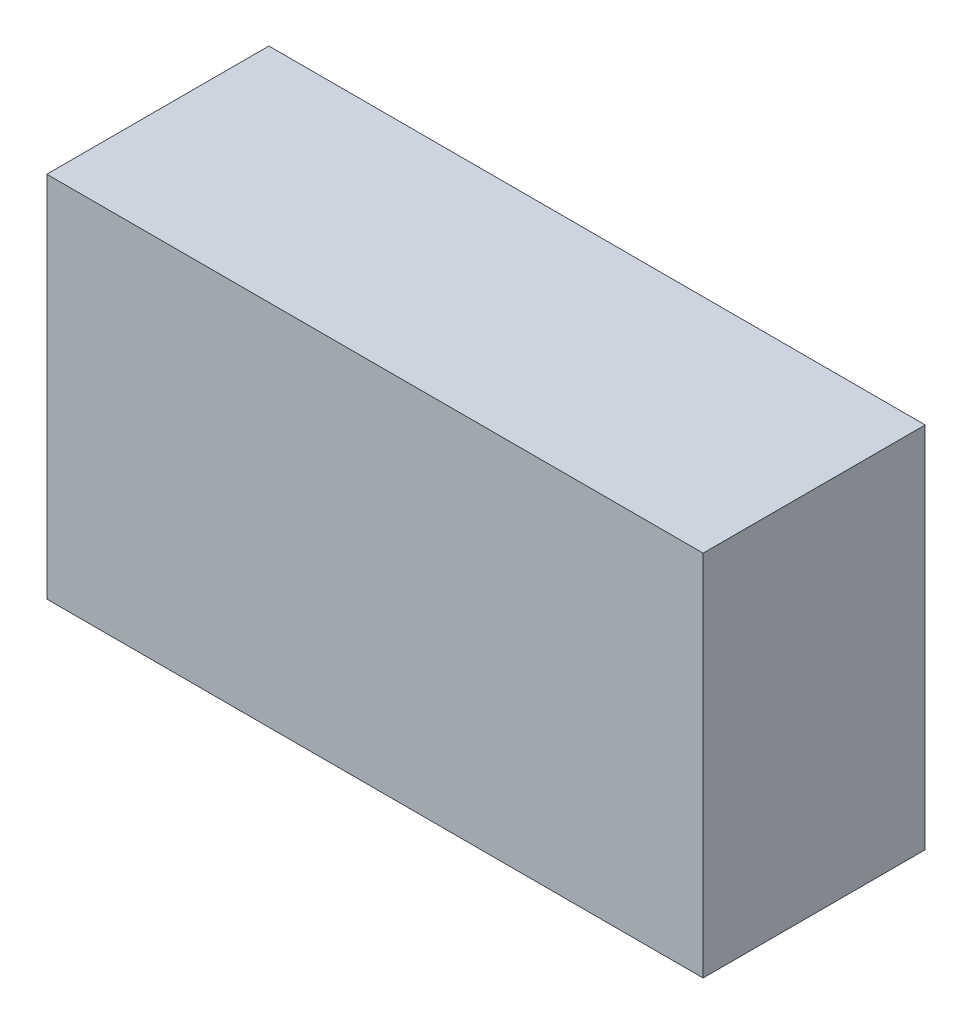
ISO-10303-21;
HEADER;
FILE_DESCRIPTION(('STEP AP214'),'2;1');
FILE_NAME('part.step','',(''),(''),'','','');
FILE_SCHEMA(('AUTOMOTIVE_DESIGN { 1 0 10303 214 1 1 1 1 }'));
ENDSEC;
DATA;
#1=APPLICATION_CONTEXT('core data for automotive mechanical design processes');
#2=APPLICATION_PROTOCOL_DEFINITION('international standard','automotive_design',2000,#1);
#3=PRODUCT_CONTEXT('',#1,'mechanical');
#4=PRODUCT('Part','Part','',(#3));
#5=PRODUCT_RELATED_PRODUCT_CATEGORY('part','',(#4));
#6=PRODUCT_DEFINITION_FORMATION('','',#4);
#7=PRODUCT_DEFINITION_CONTEXT('part definition',#1,'design');
#8=PRODUCT_DEFINITION('design','',#6,#7);
#9=PRODUCT_DEFINITION_SHAPE('','',#8);
#10=(LENGTH_UNIT() NAMED_UNIT(*) SI_UNIT(.MILLI.,.METRE.));
#11=(NAMED_UNIT(*) PLANE_ANGLE_UNIT() SI_UNIT($,.RADIAN.));
#12=(NAMED_UNIT(*) SI_UNIT($,.STERADIAN.) SOLID_ANGLE_UNIT());
#13=UNCERTAINTY_MEASURE_WITH_UNIT(LENGTH_MEASURE(1.E-05),#10,'distance_accuracy_value','');
#14=(GEOMETRIC_REPRESENTATION_CONTEXT(3) GLOBAL_UNCERTAINTY_ASSIGNED_CONTEXT((#13)) GLOBAL_UNIT_ASSIGNED_CONTEXT((#10,
#11,#12)) REPRESENTATION_CONTEXT('',''));
#15=CARTESIAN_POINT('',(0.,0.,0.));
#16=DIRECTION('',(0.,0.,1.));
#17=DIRECTION('',(1.,0.,0.));
#18=AXIS2_PLACEMENT_3D('',#15,#16,#17);
#19=CARTESIAN_POINT('',(9.99999999999967,0.,0.));
#20=DIRECTION('',(1.,0.,0.));
#21=DIRECTION('',(0.,0.,-1.));
#22=AXIS2_PLACEMENT_3D('',#19,#20,#21);
#23=PLANE('',#22);
#24=DIRECTION('',(0.,0.,1.));
#25=VECTOR('',#24,1.);
#26=CARTESIAN_POINT('',(9.99999999999967,360.,0.));
#27=LINE('',#26,#25);
#28=CARTESIAN_POINT('',(9.99999999999967,360.,-213.333333333333));
#29=VERTEX_POINT('',#28);
#30=CARTESIAN_POINT('',(9.99999999999968,360.,-10.));
#31=VERTEX_POINT('',#30);
#32=EDGE_CURVE('E173',#29,#31,#27,.T.);
#33=ORIENTED_EDGE('',*,*,#32,.T.);
#34=DIRECTION('',(0.,-1.,0.));
#35=VECTOR('',#34,1.);
#36=CARTESIAN_POINT('',(9.99999999999968,370.,-10.));
#37=LINE('',#36,#35);
#38=CARTESIAN_POINT('',(9.99999999999967,10.,-10.));
#39=VERTEX_POINT('',#38);
#40=EDGE_CURVE('E71',#31,#39,#37,.T.);
#41=ORIENTED_EDGE('',*,*,#40,.T.);
#42=DIRECTION('',(0.,0.,1.));
#43=VECTOR('',#42,1.);
#44=CARTESIAN_POINT('',(9.99999999999967,10.,0.));
#45=LINE('',#44,#43);
#46=CARTESIAN_POINT('',(9.99999999999967,10.,-213.333333333333));
#47=VERTEX_POINT('',#46);
#48=EDGE_CURVE('E11',#47,#39,#45,.T.);
#49=ORIENTED_EDGE('',*,*,#48,.F.);
#50=DIRECTION('',(0.,1.,0.));
#51=VECTOR('',#50,1.);
#52=CARTESIAN_POINT('',(9.99999999999967,370.,-213.333333333333));
#53=LINE('',#52,#51);
#54=EDGE_CURVE('E166',#47,#29,#53,.T.);
#55=ORIENTED_EDGE('',*,*,#54,.T.);
#56=EDGE_LOOP('',(#33,#41,#49,#55));
#57=FACE_BOUND('',#56,.T.);
#58=DIRECTION('',(0.,1.,0.));
#59=VECTOR('',#58,1.);
#60=CARTESIAN_POINT('',(10.,0.,0.));
#61=LINE('',#60,#59);
#62=CARTESIAN_POINT('',(10.,0.,0.));
#63=VERTEX_POINT('',#62);
#64=CARTESIAN_POINT('',(10.,370.,0.));
#65=VERTEX_POINT('',#64);
#66=EDGE_CURVE('E110',#63,#65,#61,.T.);
#67=ORIENTED_EDGE('',*,*,#66,.T.);
#68=DIRECTION('',(0.,0.,-1.));
#69=VECTOR('',#68,1.);
#70=CARTESIAN_POINT('',(10.,370.,0.));
#71=LINE('',#70,#69);
#72=CARTESIAN_POINT('',(10.,370.,-223.333333333333));
#73=VERTEX_POINT('',#72);
#74=EDGE_CURVE('E112',#65,#73,#71,.T.);
#75=ORIENTED_EDGE('',*,*,#74,.T.);
#76=DIRECTION('',(0.,-1.,0.));
#77=VECTOR('',#76,1.);
#78=CARTESIAN_POINT('',(10.,0.,-223.333333333333));
#79=LINE('',#78,#77);
#80=CARTESIAN_POINT('',(10.,0.,-223.333333333333));
#81=VERTEX_POINT('',#80);
#82=EDGE_CURVE('E63',#73,#81,#79,.T.);
#83=ORIENTED_EDGE('',*,*,#82,.T.);
#84=DIRECTION('',(0.,0.,1.));
#85=VECTOR('',#84,1.);
#86=CARTESIAN_POINT('',(10.,0.,0.));
#87=LINE('',#86,#85);
#88=EDGE_CURVE('E113',#81,#63,#87,.T.);
#89=ORIENTED_EDGE('',*,*,#88,.T.);
#90=EDGE_LOOP('',(#67,#75,#83,#89));
#91=FACE_BOUND('',#90,.T.);
#92=ADVANCED_FACE('F47',(#57,#91),#23,.F.);
#93=CARTESIAN_POINT('',(660.,370.,-223.333333333333));
#94=DIRECTION('',(-1.,0.,0.));
#95=DIRECTION('',(0.,0.,1.));
#96=AXIS2_PLACEMENT_3D('',#93,#94,#95);
#97=PLANE('',#96);
#98=DIRECTION('',(0.,0.,-1.));
#99=VECTOR('',#98,1.);
#100=CARTESIAN_POINT('',(660.,10.,0.));
#101=LINE('',#100,#99);
#102=CARTESIAN_POINT('',(660.,10.,-9.99999999999998));
#103=VERTEX_POINT('',#102);
#104=CARTESIAN_POINT('',(660.,10.,-213.333333333333));
#105=VERTEX_POINT('',#104);
#106=EDGE_CURVE('E179',#103,#105,#101,.T.);
#107=ORIENTED_EDGE('',*,*,#106,.F.);
#108=DIRECTION('',(0.,-1.,0.));
#109=VECTOR('',#108,1.);
#110=CARTESIAN_POINT('',(660.,370.,-9.99999999999998));
#111=LINE('',#110,#109);
#112=CARTESIAN_POINT('',(660.,360.,-9.99999999999998));
#113=VERTEX_POINT('',#112);
#114=EDGE_CURVE('E150',#113,#103,#111,.T.);
#115=ORIENTED_EDGE('',*,*,#114,.F.);
#116=DIRECTION('',(0.,0.,-1.));
#117=VECTOR('',#116,1.);
#118=CARTESIAN_POINT('',(660.,360.,0.));
#119=LINE('',#118,#117);
#120=CARTESIAN_POINT('',(660.,360.,-213.333333333333));
#121=VERTEX_POINT('',#120);
#122=EDGE_CURVE('E187',#113,#121,#119,.T.);
#123=ORIENTED_EDGE('',*,*,#122,.T.);
#124=DIRECTION('',(0.,-1.,0.));
#125=VECTOR('',#124,1.);
#126=CARTESIAN_POINT('',(660.,370.,-213.333333333333));
#127=LINE('',#126,#125);
#128=EDGE_CURVE('E183',#121,#105,#127,.T.);
#129=ORIENTED_EDGE('',*,*,#128,.T.);
#130=EDGE_LOOP('',(#107,#115,#123,#129));
#131=FACE_BOUND('',#130,.T.);
#132=ADVANCED_FACE('F217',(#131),#97,.T.);
#133=CARTESIAN_POINT('',(0.,360.,0.));
#134=DIRECTION('',(0.,-1.,0.));
#135=DIRECTION('',(0.,0.,-1.));
#136=AXIS2_PLACEMENT_3D('',#133,#134,#135);
#137=PLANE('',#136);
#138=ORIENTED_EDGE('',*,*,#32,.F.);
#139=DIRECTION('',(-1.,0.,0.));
#140=VECTOR('',#139,1.);
#141=CARTESIAN_POINT('',(0.,360.,-213.333333333333));
#142=LINE('',#141,#140);
#143=EDGE_CURVE('E141',#121,#29,#142,.T.);
#144=ORIENTED_EDGE('',*,*,#143,.F.);
#145=ORIENTED_EDGE('',*,*,#122,.F.);
#146=DIRECTION('',(1.,0.,0.));
#147=VECTOR('',#146,1.);
#148=CARTESIAN_POINT('',(0.,360.,-10.));
#149=LINE('',#148,#147);
#150=EDGE_CURVE('E184',#31,#113,#149,.T.);
#151=ORIENTED_EDGE('',*,*,#150,.F.);
#152=EDGE_LOOP('',(#138,#144,#145,#151));
#153=FACE_BOUND('',#152,.T.);
#154=ADVANCED_FACE('F211',(#153),#137,.T.);
#155=CARTESIAN_POINT('',(0.,10.,0.));
#156=DIRECTION('',(0.,-1.,0.));
#157=DIRECTION('',(0.,0.,-1.));
#158=AXIS2_PLACEMENT_3D('',#155,#156,#157);
#159=PLANE('',#158);
#160=DIRECTION('',(-1.,0.,0.));
#161=VECTOR('',#160,1.);
#162=CARTESIAN_POINT('',(0.,10.,-213.333333333333));
#163=LINE('',#162,#161);
#164=EDGE_CURVE('E188',#105,#47,#163,.T.);
#165=ORIENTED_EDGE('',*,*,#164,.T.);
#166=ORIENTED_EDGE('',*,*,#48,.T.);
#167=DIRECTION('',(1.,0.,0.));
#168=VECTOR('',#167,1.);
#169=CARTESIAN_POINT('',(0.,10.,-10.));
#170=LINE('',#169,#168);
#171=EDGE_CURVE('E176',#39,#103,#170,.T.);
#172=ORIENTED_EDGE('',*,*,#171,.T.);
#173=ORIENTED_EDGE('',*,*,#106,.T.);
#174=EDGE_LOOP('',(#165,#166,#172,#173));
#175=FACE_BOUND('',#174,.T.);
#176=ADVANCED_FACE('F199',(#175),#159,.F.);
#177=CARTESIAN_POINT('',(0.,370.,-213.333333333333));
#178=DIRECTION('',(0.,0.,1.));
#179=DIRECTION('',(1.,0.,0.));
#180=AXIS2_PLACEMENT_3D('',#177,#178,#179);
#181=PLANE('',#180);
#182=ORIENTED_EDGE('',*,*,#54,.F.);
#183=ORIENTED_EDGE('',*,*,#164,.F.);
#184=ORIENTED_EDGE('',*,*,#128,.F.);
#185=ORIENTED_EDGE('',*,*,#143,.T.);
#186=EDGE_LOOP('',(#182,#183,#184,#185));
#187=FACE_BOUND('',#186,.T.);
#188=ADVANCED_FACE('F205',(#187),#181,.T.);
#189=CARTESIAN_POINT('',(670.,370.,-9.99999999999998));
#190=DIRECTION('',(0.,0.,-1.));
#191=DIRECTION('',(-1.,0.,0.));
#192=AXIS2_PLACEMENT_3D('',#189,#190,#191);
#193=PLANE('',#192);
#194=ORIENTED_EDGE('',*,*,#40,.F.);
#195=ORIENTED_EDGE('',*,*,#150,.T.);
#196=ORIENTED_EDGE('',*,*,#114,.T.);
#197=ORIENTED_EDGE('',*,*,#171,.F.);
#198=EDGE_LOOP('',(#194,#195,#196,#197));
#199=FACE_BOUND('',#198,.T.);
#200=ADVANCED_FACE('F215',(#199),#193,.T.);
#201=CARTESIAN_POINT('',(670.,370.,-223.333333333333));
#202=DIRECTION('',(-1.,0.,0.));
#203=DIRECTION('',(0.,0.,1.));
#204=AXIS2_PLACEMENT_3D('',#201,#202,#203);
#205=PLANE('',#204);
#206=DIRECTION('',(0.,0.,-1.));
#207=VECTOR('',#206,1.);
#208=CARTESIAN_POINT('',(670.,0.,-223.333333333333));
#209=LINE('',#208,#207);
#210=CARTESIAN_POINT('',(670.,0.,0.));
#211=VERTEX_POINT('',#210);
#212=CARTESIAN_POINT('',(670.,0.,-223.333333333333));
#213=VERTEX_POINT('',#212);
#214=EDGE_CURVE('E138',#211,#213,#209,.T.);
#215=ORIENTED_EDGE('',*,*,#214,.T.);
#216=DIRECTION('',(0.,-1.,0.));
#217=VECTOR('',#216,1.);
#218=CARTESIAN_POINT('',(670.,370.,-223.333333333333));
#219=LINE('',#218,#217);
#220=CARTESIAN_POINT('',(670.,370.,-223.333333333333));
#221=VERTEX_POINT('',#220);
#222=EDGE_CURVE('E146',#221,#213,#219,.T.);
#223=ORIENTED_EDGE('',*,*,#222,.F.);
#224=DIRECTION('',(0.,0.,-1.));
#225=VECTOR('',#224,1.);
#226=CARTESIAN_POINT('',(670.,370.,-223.333333333333));
#227=LINE('',#226,#225);
#228=CARTESIAN_POINT('',(670.,370.,0.));
#229=VERTEX_POINT('',#228);
#230=EDGE_CURVE('E131',#229,#221,#227,.T.);
#231=ORIENTED_EDGE('',*,*,#230,.F.);
#232=DIRECTION('',(0.,-1.,0.));
#233=VECTOR('',#232,1.);
#234=CARTESIAN_POINT('',(670.,370.,0.));
#235=LINE('',#234,#233);
#236=EDGE_CURVE('E56',#229,#211,#235,.T.);
#237=ORIENTED_EDGE('',*,*,#236,.T.);
#238=EDGE_LOOP('',(#215,#223,#231,#237));
#239=FACE_BOUND('',#238,.T.);
#240=ADVANCED_FACE('F157',(#239),#205,.F.);
#241=CARTESIAN_POINT('',(0.,0.,0.));
#242=DIRECTION('',(0.,-1.,0.));
#243=DIRECTION('',(0.,0.,-1.));
#244=AXIS2_PLACEMENT_3D('',#241,#242,#243);
#245=PLANE('',#244);
#246=DIRECTION('',(1.,0.,0.));
#247=VECTOR('',#246,1.);
#248=CARTESIAN_POINT('',(670.,0.,0.));
#249=LINE('',#248,#247);
#250=EDGE_CURVE('E147',#63,#211,#249,.T.);
#251=ORIENTED_EDGE('',*,*,#250,.F.);
#252=ORIENTED_EDGE('',*,*,#88,.F.);
#253=DIRECTION('',(-1.,0.,0.));
#254=VECTOR('',#253,1.);
#255=CARTESIAN_POINT('',(0.,0.,-223.333333333333));
#256=LINE('',#255,#254);
#257=EDGE_CURVE('E132',#213,#81,#256,.T.);
#258=ORIENTED_EDGE('',*,*,#257,.F.);
#259=ORIENTED_EDGE('',*,*,#214,.F.);
#260=EDGE_LOOP('',(#251,#252,#258,#259));
#261=FACE_BOUND('',#260,.T.);
#262=ADVANCED_FACE('F235',(#261),#245,.T.);
#263=CARTESIAN_POINT('',(0.,370.,0.));
#264=DIRECTION('',(0.,-1.,0.));
#265=DIRECTION('',(0.,0.,-1.));
#266=AXIS2_PLACEMENT_3D('',#263,#264,#265);
#267=PLANE('',#266);
#268=ORIENTED_EDGE('',*,*,#74,.F.);
#269=DIRECTION('',(1.,0.,0.));
#270=VECTOR('',#269,1.);
#271=CARTESIAN_POINT('',(670.,370.,0.));
#272=LINE('',#271,#270);
#273=EDGE_CURVE('E122',#65,#229,#272,.T.);
#274=ORIENTED_EDGE('',*,*,#273,.T.);
#275=ORIENTED_EDGE('',*,*,#230,.T.);
#276=DIRECTION('',(-1.,0.,0.));
#277=VECTOR('',#276,1.);
#278=CARTESIAN_POINT('',(0.,370.,-223.333333333333));
#279=LINE('',#278,#277);
#280=EDGE_CURVE('E125',#221,#73,#279,.T.);
#281=ORIENTED_EDGE('',*,*,#280,.T.);
#282=EDGE_LOOP('',(#268,#274,#275,#281));
#283=FACE_BOUND('',#282,.T.);
#284=ADVANCED_FACE('F121',(#283),#267,.F.);
#285=CARTESIAN_POINT('',(0.,370.,-223.333333333333));
#286=DIRECTION('',(0.,0.,1.));
#287=DIRECTION('',(1.,0.,0.));
#288=AXIS2_PLACEMENT_3D('',#285,#286,#287);
#289=PLANE('',#288);
#290=ORIENTED_EDGE('',*,*,#82,.F.);
#291=ORIENTED_EDGE('',*,*,#280,.F.);
#292=ORIENTED_EDGE('',*,*,#222,.T.);
#293=ORIENTED_EDGE('',*,*,#257,.T.);
#294=EDGE_LOOP('',(#290,#291,#292,#293));
#295=FACE_BOUND('',#294,.T.);
#296=ADVANCED_FACE('F162',(#295),#289,.F.);
#297=CARTESIAN_POINT('',(670.,370.,0.));
#298=DIRECTION('',(0.,0.,-1.));
#299=DIRECTION('',(-1.,0.,0.));
#300=AXIS2_PLACEMENT_3D('',#297,#298,#299);
#301=PLANE('',#300);
#302=ORIENTED_EDGE('',*,*,#66,.F.);
#303=ORIENTED_EDGE('',*,*,#250,.T.);
#304=ORIENTED_EDGE('',*,*,#236,.F.);
#305=ORIENTED_EDGE('',*,*,#273,.F.);
#306=EDGE_LOOP('',(#302,#303,#304,#305));
#307=FACE_BOUND('',#306,.T.);
#308=ADVANCED_FACE('F49',(#307),#301,.F.);
#309=CLOSED_SHELL('',(#92,#132,#154,#176,#188,#200,#240,#262,#284,#296,#308));
#310=MANIFOLD_SOLID_BREP('B2',#309);
#311=ADVANCED_BREP_SHAPE_REPRESENTATION('',(#18,#310),#14);
#312=SHAPE_DEFINITION_REPRESENTATION(#9,#311);
ENDSEC;
END-ISO-10303-21;
